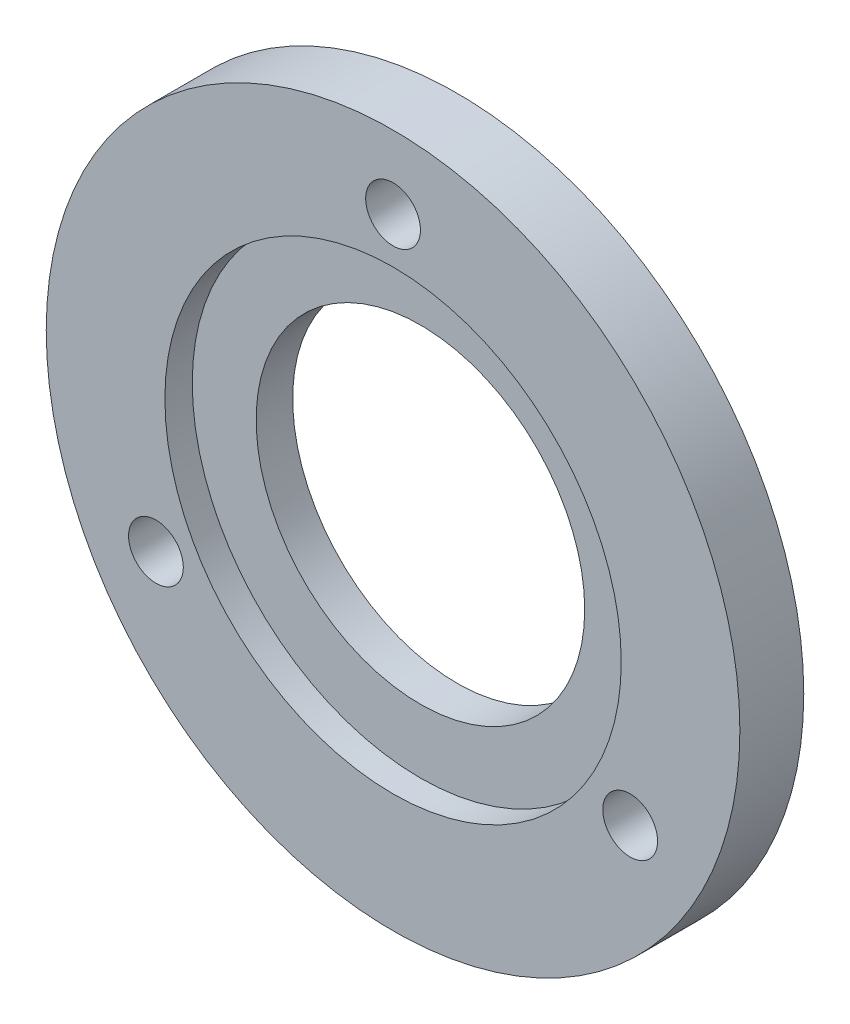
ISO-10303-21;
HEADER;
FILE_DESCRIPTION(('STEP AP214'),'2;1');
FILE_NAME('part.step','',(''),(''),'','','');
FILE_SCHEMA(('AUTOMOTIVE_DESIGN { 1 0 10303 214 1 1 1 1 }'));
ENDSEC;
DATA;
#1=APPLICATION_CONTEXT('core data for automotive mechanical design processes');
#2=APPLICATION_PROTOCOL_DEFINITION('international standard','automotive_design',2000,#1);
#3=PRODUCT_CONTEXT('',#1,'mechanical');
#4=PRODUCT('Part','Part','',(#3));
#5=PRODUCT_RELATED_PRODUCT_CATEGORY('part','',(#4));
#6=PRODUCT_DEFINITION_FORMATION('','',#4);
#7=PRODUCT_DEFINITION_CONTEXT('part definition',#1,'design');
#8=PRODUCT_DEFINITION('design','',#6,#7);
#9=PRODUCT_DEFINITION_SHAPE('','',#8);
#10=(LENGTH_UNIT() NAMED_UNIT(*) SI_UNIT(.MILLI.,.METRE.));
#11=(NAMED_UNIT(*) PLANE_ANGLE_UNIT() SI_UNIT($,.RADIAN.));
#12=(NAMED_UNIT(*) SI_UNIT($,.STERADIAN.) SOLID_ANGLE_UNIT());
#13=UNCERTAINTY_MEASURE_WITH_UNIT(LENGTH_MEASURE(1.E-05),#10,'distance_accuracy_value','');
#14=(GEOMETRIC_REPRESENTATION_CONTEXT(3) GLOBAL_UNCERTAINTY_ASSIGNED_CONTEXT((#13)) GLOBAL_UNIT_ASSIGNED_CONTEXT((#10,
#11,#12)) REPRESENTATION_CONTEXT('',''));
#15=CARTESIAN_POINT('',(0.,0.,0.));
#16=DIRECTION('',(0.,0.,1.));
#17=DIRECTION('',(1.,0.,0.));
#18=AXIS2_PLACEMENT_3D('',#15,#16,#17);
#19=CARTESIAN_POINT('',(0.,0.,2.));
#20=DIRECTION('',(0.,0.,-1.));
#21=DIRECTION('',(-1.,0.,0.));
#22=AXIS2_PLACEMENT_3D('',#19,#20,#21);
#23=CYLINDRICAL_SURFACE('',#22,19.);
#24=CARTESIAN_POINT('',(0.,0.,0.));
#25=DIRECTION('',(0.,0.,1.));
#26=DIRECTION('',(1.,0.,0.));
#27=AXIS2_PLACEMENT_3D('',#24,#25,#26);
#28=CIRCLE('',#27,19.);
#29=CARTESIAN_POINT('',(19.,0.,0.));
#30=VERTEX_POINT('',#29);
#31=EDGE_CURVE('E55',#30,#30,#28,.T.);
#32=ORIENTED_EDGE('',*,*,#31,.T.);
#33=EDGE_LOOP('',(#32));
#34=FACE_BOUND('',#33,.T.);
#35=CARTESIAN_POINT('',(0.,0.,3.5));
#36=DIRECTION('',(0.,0.,1.));
#37=DIRECTION('',(1.,0.,0.));
#38=AXIS2_PLACEMENT_3D('',#35,#36,#37);
#39=CIRCLE('',#38,19.);
#40=CARTESIAN_POINT('',(19.,0.,3.5));
#41=VERTEX_POINT('',#40);
#42=EDGE_CURVE('E63',#41,#41,#39,.T.);
#43=ORIENTED_EDGE('',*,*,#42,.F.);
#44=EDGE_LOOP('',(#43));
#45=FACE_BOUND('',#44,.T.);
#46=ADVANCED_FACE('F47',(#34,#45),#23,.T.);
#47=CARTESIAN_POINT('',(0.,0.,0.));
#48=DIRECTION('',(0.,0.,1.));
#49=DIRECTION('',(1.,0.,0.));
#50=AXIS2_PLACEMENT_3D('',#47,#48,#49);
#51=PLANE('',#50);
#52=CARTESIAN_POINT('',(-12.9903810567665,-7.50000000000006,0.));
#53=DIRECTION('',(0.,0.,1.));
#54=DIRECTION('',(1.,0.,0.));
#55=AXIS2_PLACEMENT_3D('',#52,#53,#54);
#56=CIRCLE('',#55,1.5);
#57=CARTESIAN_POINT('',(-11.4903810567665,-7.50000000000006,0.));
#58=VERTEX_POINT('',#57);
#59=EDGE_CURVE('E84',#58,#58,#56,.F.);
#60=ORIENTED_EDGE('',*,*,#59,.F.);
#61=EDGE_LOOP('',(#60));
#62=FACE_BOUND('',#61,.T.);
#63=CARTESIAN_POINT('',(12.9903810567666,-7.49999999999988,0.));
#64=DIRECTION('',(0.,0.,1.));
#65=DIRECTION('',(1.,0.,0.));
#66=AXIS2_PLACEMENT_3D('',#63,#64,#65);
#67=CIRCLE('',#66,1.5);
#68=CARTESIAN_POINT('',(14.4903810567667,-7.49999999999988,0.));
#69=VERTEX_POINT('',#68);
#70=EDGE_CURVE('E88',#69,#69,#67,.F.);
#71=ORIENTED_EDGE('',*,*,#70,.F.);
#72=EDGE_LOOP('',(#71));
#73=FACE_BOUND('',#72,.T.);
#74=CARTESIAN_POINT('',(0.,15.,0.));
#75=DIRECTION('',(0.,0.,1.));
#76=DIRECTION('',(1.,0.,0.));
#77=AXIS2_PLACEMENT_3D('',#74,#75,#76);
#78=CIRCLE('',#77,1.5);
#79=CARTESIAN_POINT('',(1.5,15.,0.));
#80=VERTEX_POINT('',#79);
#81=EDGE_CURVE('E76',#80,#80,#78,.F.);
#82=ORIENTED_EDGE('',*,*,#81,.F.);
#83=EDGE_LOOP('',(#82));
#84=FACE_BOUND('',#83,.T.);
#85=CARTESIAN_POINT('',(0.,0.,0.));
#86=DIRECTION('',(0.,0.,1.));
#87=DIRECTION('',(1.,0.,0.));
#88=AXIS2_PLACEMENT_3D('',#85,#86,#87);
#89=CIRCLE('',#88,9.);
#90=CARTESIAN_POINT('',(9.,0.,0.));
#91=VERTEX_POINT('',#90);
#92=EDGE_CURVE('E73',#91,#91,#89,.T.);
#93=ORIENTED_EDGE('',*,*,#92,.T.);
#94=EDGE_LOOP('',(#93));
#95=FACE_BOUND('',#94,.T.);
#96=ORIENTED_EDGE('',*,*,#31,.F.);
#97=EDGE_LOOP('',(#96));
#98=FACE_BOUND('',#97,.T.);
#99=ADVANCED_FACE('F109',(#62,#73,#84,#95,#98),#51,.F.);
#100=CARTESIAN_POINT('',(0.,0.,3.5));
#101=DIRECTION('',(0.,0.,1.));
#102=DIRECTION('',(1.,0.,0.));
#103=AXIS2_PLACEMENT_3D('',#100,#101,#102);
#104=PLANE('',#103);
#105=CARTESIAN_POINT('',(-12.9903810567665,-7.50000000000006,3.5));
#106=DIRECTION('',(0.,0.,1.));
#107=DIRECTION('',(-0.500000000000004,0.866025403784436,0.));
#108=AXIS2_PLACEMENT_3D('',#105,#106,#107);
#109=CIRCLE('',#108,1.5);
#110=CARTESIAN_POINT('',(-13.7403810567666,-6.20096189432341,3.5));
#111=VERTEX_POINT('',#110);
#112=EDGE_CURVE('E92',#111,#111,#109,.T.);
#113=ORIENTED_EDGE('',*,*,#112,.F.);
#114=EDGE_LOOP('',(#113));
#115=FACE_BOUND('',#114,.T.);
#116=CARTESIAN_POINT('',(12.9903810567666,-7.49999999999988,3.5));
#117=DIRECTION('',(0.,0.,1.));
#118=DIRECTION('',(-0.499999999999992,-0.866025403784443,0.));
#119=AXIS2_PLACEMENT_3D('',#116,#117,#118);
#120=CIRCLE('',#119,1.5);
#121=CARTESIAN_POINT('',(12.2403810567667,-8.79903810567654,3.5));
#122=VERTEX_POINT('',#121);
#123=EDGE_CURVE('E93',#122,#122,#120,.T.);
#124=ORIENTED_EDGE('',*,*,#123,.F.);
#125=EDGE_LOOP('',(#124));
#126=FACE_BOUND('',#125,.T.);
#127=CARTESIAN_POINT('',(0.,15.,3.5));
#128=DIRECTION('',(0.,0.,1.));
#129=DIRECTION('',(1.,0.,0.));
#130=AXIS2_PLACEMENT_3D('',#127,#128,#129);
#131=CIRCLE('',#130,1.5);
#132=CARTESIAN_POINT('',(1.5,15.,3.5));
#133=VERTEX_POINT('',#132);
#134=EDGE_CURVE('E80',#133,#133,#131,.T.);
#135=ORIENTED_EDGE('',*,*,#134,.F.);
#136=EDGE_LOOP('',(#135));
#137=FACE_BOUND('',#136,.T.);
#138=ORIENTED_EDGE('',*,*,#42,.T.);
#139=EDGE_LOOP('',(#138));
#140=FACE_BOUND('',#139,.T.);
#141=CARTESIAN_POINT('',(0.,0.,3.5));
#142=DIRECTION('',(0.,0.,1.));
#143=DIRECTION('',(1.,0.,0.));
#144=AXIS2_PLACEMENT_3D('',#141,#142,#143);
#145=CIRCLE('',#144,12.5);
#146=CARTESIAN_POINT('',(12.5,0.,3.5));
#147=VERTEX_POINT('',#146);
#148=EDGE_CURVE('E69',#147,#147,#145,.T.);
#149=ORIENTED_EDGE('',*,*,#148,.F.);
#150=EDGE_LOOP('',(#149));
#151=FACE_BOUND('',#150,.T.);
#152=ADVANCED_FACE('F105',(#115,#126,#137,#140,#151),#104,.T.);
#153=CARTESIAN_POINT('',(0.,0.,3.5));
#154=DIRECTION('',(0.,0.,-1.));
#155=DIRECTION('',(-1.,0.,0.));
#156=AXIS2_PLACEMENT_3D('',#153,#154,#155);
#157=CYLINDRICAL_SURFACE('',#156,12.5);
#158=ORIENTED_EDGE('',*,*,#148,.T.);
#159=EDGE_LOOP('',(#158));
#160=FACE_BOUND('',#159,.T.);
#161=CARTESIAN_POINT('',(0.,0.,2.));
#162=DIRECTION('',(0.,0.,1.));
#163=DIRECTION('',(1.,0.,0.));
#164=AXIS2_PLACEMENT_3D('',#161,#162,#163);
#165=CIRCLE('',#164,12.5);
#166=CARTESIAN_POINT('',(12.5,0.,2.));
#167=VERTEX_POINT('',#166);
#168=EDGE_CURVE('E10',#167,#167,#165,.F.);
#169=ORIENTED_EDGE('',*,*,#168,.T.);
#170=EDGE_LOOP('',(#169));
#171=FACE_BOUND('',#170,.T.);
#172=ADVANCED_FACE('F108',(#160,#171),#157,.F.);
#173=CARTESIAN_POINT('',(0.,0.,2.));
#174=DIRECTION('',(0.,0.,1.));
#175=DIRECTION('',(1.,0.,0.));
#176=AXIS2_PLACEMENT_3D('',#173,#174,#175);
#177=PLANE('',#176);
#178=CARTESIAN_POINT('',(0.,0.,2.));
#179=DIRECTION('',(0.,0.,1.));
#180=DIRECTION('',(1.,0.,0.));
#181=AXIS2_PLACEMENT_3D('',#178,#179,#180);
#182=CIRCLE('',#181,9.);
#183=CARTESIAN_POINT('',(9.,0.,2.));
#184=VERTEX_POINT('',#183);
#185=EDGE_CURVE('E50',#184,#184,#182,.T.);
#186=ORIENTED_EDGE('',*,*,#185,.F.);
#187=EDGE_LOOP('',(#186));
#188=FACE_BOUND('',#187,.T.);
#189=ORIENTED_EDGE('',*,*,#168,.F.);
#190=EDGE_LOOP('',(#189));
#191=FACE_BOUND('',#190,.T.);
#192=ADVANCED_FACE('F120',(#188,#191),#177,.T.);
#193=CARTESIAN_POINT('',(0.,0.,0.));
#194=DIRECTION('',(0.,0.,1.));
#195=DIRECTION('',(1.,0.,0.));
#196=AXIS2_PLACEMENT_3D('',#193,#194,#195);
#197=CYLINDRICAL_SURFACE('',#196,9.);
#198=ORIENTED_EDGE('',*,*,#185,.T.);
#199=EDGE_LOOP('',(#198));
#200=FACE_BOUND('',#199,.T.);
#201=ORIENTED_EDGE('',*,*,#92,.F.);
#202=EDGE_LOOP('',(#201));
#203=FACE_BOUND('',#202,.T.);
#204=ADVANCED_FACE('F124',(#200,#203),#197,.F.);
#205=CARTESIAN_POINT('',(0.,15.,3.5));
#206=DIRECTION('',(0.,0.,-1.));
#207=DIRECTION('',(-1.,0.,0.));
#208=AXIS2_PLACEMENT_3D('',#205,#206,#207);
#209=CYLINDRICAL_SURFACE('',#208,1.5);
#210=ORIENTED_EDGE('',*,*,#134,.T.);
#211=EDGE_LOOP('',(#210));
#212=FACE_BOUND('',#211,.T.);
#213=ORIENTED_EDGE('',*,*,#81,.T.);
#214=EDGE_LOOP('',(#213));
#215=FACE_BOUND('',#214,.T.);
#216=ADVANCED_FACE('F146',(#212,#215),#209,.F.);
#217=CARTESIAN_POINT('',(12.9903810567666,-7.49999999999988,3.5));
#218=DIRECTION('',(0.,0.,-1.));
#219=DIRECTION('',(-1.,0.,0.));
#220=AXIS2_PLACEMENT_3D('',#217,#218,#219);
#221=CYLINDRICAL_SURFACE('',#220,1.5);
#222=ORIENTED_EDGE('',*,*,#123,.T.);
#223=EDGE_LOOP('',(#222));
#224=FACE_BOUND('',#223,.T.);
#225=ORIENTED_EDGE('',*,*,#70,.T.);
#226=EDGE_LOOP('',(#225));
#227=FACE_BOUND('',#226,.T.);
#228=ADVANCED_FACE('F150',(#224,#227),#221,.F.);
#229=CARTESIAN_POINT('',(-12.9903810567665,-7.50000000000006,3.5));
#230=DIRECTION('',(0.,0.,-1.));
#231=DIRECTION('',(-1.,0.,0.));
#232=AXIS2_PLACEMENT_3D('',#229,#230,#231);
#233=CYLINDRICAL_SURFACE('',#232,1.5);
#234=ORIENTED_EDGE('',*,*,#112,.T.);
#235=EDGE_LOOP('',(#234));
#236=FACE_BOUND('',#235,.T.);
#237=ORIENTED_EDGE('',*,*,#59,.T.);
#238=EDGE_LOOP('',(#237));
#239=FACE_BOUND('',#238,.T.);
#240=ADVANCED_FACE('F102',(#236,#239),#233,.F.);
#241=CLOSED_SHELL('',(#46,#99,#152,#172,#192,#204,#216,#228,#240));
#242=MANIFOLD_SOLID_BREP('B2',#241);
#243=ADVANCED_BREP_SHAPE_REPRESENTATION('',(#18,#242),#14);
#244=SHAPE_DEFINITION_REPRESENTATION(#9,#243);
ENDSEC;
END-ISO-10303-21;
